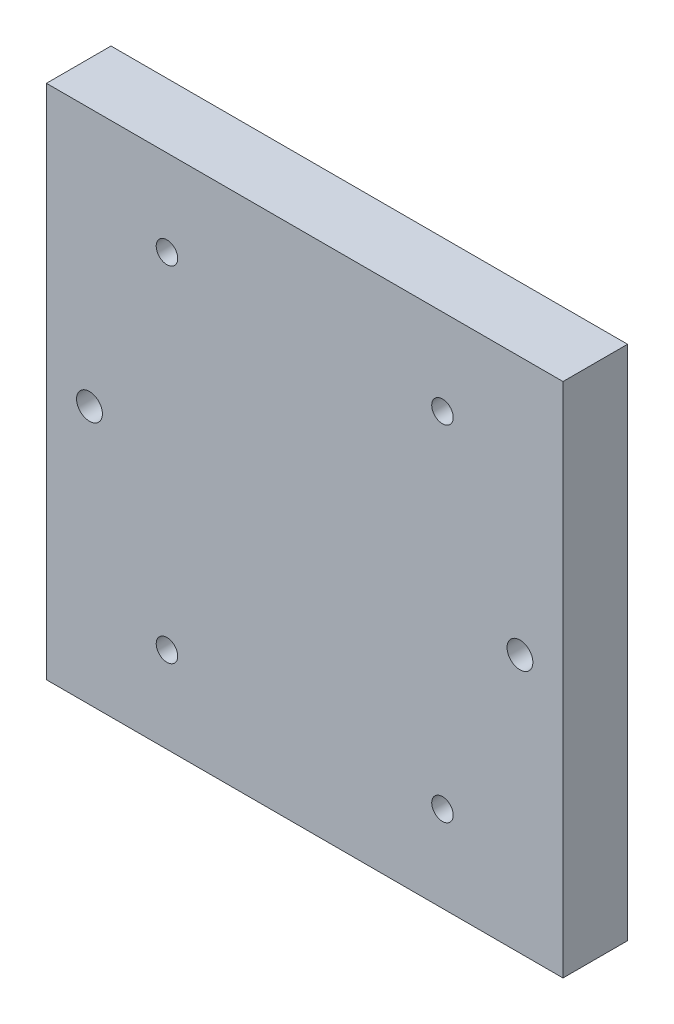
ISO-10303-21;
HEADER;
FILE_DESCRIPTION(('STEP AP214'),'2;1');
FILE_NAME('part.step','',(''),(''),'','','');
FILE_SCHEMA(('AUTOMOTIVE_DESIGN { 1 0 10303 214 1 1 1 1 }'));
ENDSEC;
DATA;
#1=APPLICATION_CONTEXT('core data for automotive mechanical design processes');
#2=APPLICATION_PROTOCOL_DEFINITION('international standard','automotive_design',2000,#1);
#3=PRODUCT_CONTEXT('',#1,'mechanical');
#4=PRODUCT('Part','Part','',(#3));
#5=PRODUCT_RELATED_PRODUCT_CATEGORY('part','',(#4));
#6=PRODUCT_DEFINITION_FORMATION('','',#4);
#7=PRODUCT_DEFINITION_CONTEXT('part definition',#1,'design');
#8=PRODUCT_DEFINITION('design','',#6,#7);
#9=PRODUCT_DEFINITION_SHAPE('','',#8);
#10=(LENGTH_UNIT() NAMED_UNIT(*) SI_UNIT(.MILLI.,.METRE.));
#11=(NAMED_UNIT(*) PLANE_ANGLE_UNIT() SI_UNIT($,.RADIAN.));
#12=(NAMED_UNIT(*) SI_UNIT($,.STERADIAN.) SOLID_ANGLE_UNIT());
#13=UNCERTAINTY_MEASURE_WITH_UNIT(LENGTH_MEASURE(1.E-05),#10,'distance_accuracy_value','');
#14=(GEOMETRIC_REPRESENTATION_CONTEXT(3) GLOBAL_UNCERTAINTY_ASSIGNED_CONTEXT((#13)) GLOBAL_UNIT_ASSIGNED_CONTEXT((#10,
#11,#12)) REPRESENTATION_CONTEXT('',''));
#15=CARTESIAN_POINT('',(0.,0.,0.));
#16=DIRECTION('',(0.,0.,1.));
#17=DIRECTION('',(1.,0.,0.));
#18=AXIS2_PLACEMENT_3D('',#15,#16,#17);
#19=CARTESIAN_POINT('',(60.,60.,-15.));
#20=DIRECTION('',(1.,0.,0.));
#21=DIRECTION('',(0.,1.,0.));
#22=AXIS2_PLACEMENT_3D('',#19,#20,#21);
#23=PLANE('',#22);
#24=DIRECTION('',(0.,1.,0.));
#25=VECTOR('',#24,1.);
#26=CARTESIAN_POINT('',(60.,60.,0.));
#27=LINE('',#26,#25);
#28=CARTESIAN_POINT('',(60.,-60.,0.));
#29=VERTEX_POINT('',#28);
#30=CARTESIAN_POINT('',(60.,60.,0.));
#31=VERTEX_POINT('',#30);
#32=EDGE_CURVE('E108',#29,#31,#27,.T.);
#33=ORIENTED_EDGE('',*,*,#32,.F.);
#34=DIRECTION('',(0.,0.,1.));
#35=VECTOR('',#34,1.);
#36=CARTESIAN_POINT('',(60.,-60.,-15.));
#37=LINE('',#36,#35);
#38=CARTESIAN_POINT('',(60.,-60.,-15.));
#39=VERTEX_POINT('',#38);
#40=EDGE_CURVE('E11',#39,#29,#37,.T.);
#41=ORIENTED_EDGE('',*,*,#40,.F.);
#42=DIRECTION('',(0.,1.,0.));
#43=VECTOR('',#42,1.);
#44=CARTESIAN_POINT('',(60.,60.,-15.));
#45=LINE('',#44,#43);
#46=CARTESIAN_POINT('',(60.,60.,-15.));
#47=VERTEX_POINT('',#46);
#48=EDGE_CURVE('E101',#39,#47,#45,.T.);
#49=ORIENTED_EDGE('',*,*,#48,.T.);
#50=DIRECTION('',(0.,0.,1.));
#51=VECTOR('',#50,1.);
#52=CARTESIAN_POINT('',(60.,60.,-15.));
#53=LINE('',#52,#51);
#54=EDGE_CURVE('E46',#47,#31,#53,.T.);
#55=ORIENTED_EDGE('',*,*,#54,.T.);
#56=EDGE_LOOP('',(#33,#41,#49,#55));
#57=FACE_BOUND('',#56,.T.);
#58=ADVANCED_FACE('F43',(#57),#23,.T.);
#59=CARTESIAN_POINT('',(-60.,-60.,-15.));
#60=DIRECTION('',(0.,-1.,0.));
#61=DIRECTION('',(0.,0.,-1.));
#62=AXIS2_PLACEMENT_3D('',#59,#60,#61);
#63=PLANE('',#62);
#64=DIRECTION('',(1.,0.,0.));
#65=VECTOR('',#64,1.);
#66=CARTESIAN_POINT('',(-60.,-60.,0.));
#67=LINE('',#66,#65);
#68=CARTESIAN_POINT('',(-60.,-60.,0.));
#69=VERTEX_POINT('',#68);
#70=EDGE_CURVE('E103',#69,#29,#67,.T.);
#71=ORIENTED_EDGE('',*,*,#70,.F.);
#72=DIRECTION('',(0.,0.,1.));
#73=VECTOR('',#72,1.);
#74=CARTESIAN_POINT('',(-60.,-60.,-15.));
#75=LINE('',#74,#73);
#76=CARTESIAN_POINT('',(-60.,-60.,-15.));
#77=VERTEX_POINT('',#76);
#78=EDGE_CURVE('E52',#77,#69,#75,.T.);
#79=ORIENTED_EDGE('',*,*,#78,.F.);
#80=DIRECTION('',(1.,0.,0.));
#81=VECTOR('',#80,1.);
#82=CARTESIAN_POINT('',(-60.,-60.,-15.));
#83=LINE('',#82,#81);
#84=EDGE_CURVE('E98',#77,#39,#83,.T.);
#85=ORIENTED_EDGE('',*,*,#84,.T.);
#86=ORIENTED_EDGE('',*,*,#40,.T.);
#87=EDGE_LOOP('',(#71,#79,#85,#86));
#88=FACE_BOUND('',#87,.T.);
#89=ADVANCED_FACE('F119',(#88),#63,.T.);
#90=CARTESIAN_POINT('',(-60.,60.,-15.));
#91=DIRECTION('',(-1.,0.,0.));
#92=DIRECTION('',(0.,-1.,0.));
#93=AXIS2_PLACEMENT_3D('',#90,#91,#92);
#94=PLANE('',#93);
#95=DIRECTION('',(0.,-1.,0.));
#96=VECTOR('',#95,1.);
#97=CARTESIAN_POINT('',(-60.,60.,0.));
#98=LINE('',#97,#96);
#99=CARTESIAN_POINT('',(-60.,60.,0.));
#100=VERTEX_POINT('',#99);
#101=EDGE_CURVE('E93',#100,#69,#98,.T.);
#102=ORIENTED_EDGE('',*,*,#101,.F.);
#103=DIRECTION('',(0.,0.,1.));
#104=VECTOR('',#103,1.);
#105=CARTESIAN_POINT('',(-60.,60.,-15.));
#106=LINE('',#105,#104);
#107=CARTESIAN_POINT('',(-60.,60.,-15.));
#108=VERTEX_POINT('',#107);
#109=EDGE_CURVE('E88',#108,#100,#106,.T.);
#110=ORIENTED_EDGE('',*,*,#109,.F.);
#111=DIRECTION('',(0.,-1.,0.));
#112=VECTOR('',#111,1.);
#113=CARTESIAN_POINT('',(-60.,60.,-15.));
#114=LINE('',#113,#112);
#115=EDGE_CURVE('E91',#108,#77,#114,.T.);
#116=ORIENTED_EDGE('',*,*,#115,.T.);
#117=ORIENTED_EDGE('',*,*,#78,.T.);
#118=EDGE_LOOP('',(#102,#110,#116,#117));
#119=FACE_BOUND('',#118,.T.);
#120=ADVANCED_FACE('F90',(#119),#94,.T.);
#121=CARTESIAN_POINT('',(-60.,60.,-15.));
#122=DIRECTION('',(0.,1.,0.));
#123=DIRECTION('',(0.,0.,1.));
#124=AXIS2_PLACEMENT_3D('',#121,#122,#123);
#125=PLANE('',#124);
#126=DIRECTION('',(-1.,0.,0.));
#127=VECTOR('',#126,1.);
#128=CARTESIAN_POINT('',(-60.,60.,0.));
#129=LINE('',#128,#127);
#130=EDGE_CURVE('E111',#31,#100,#129,.T.);
#131=ORIENTED_EDGE('',*,*,#130,.F.);
#132=ORIENTED_EDGE('',*,*,#54,.F.);
#133=DIRECTION('',(-1.,0.,0.));
#134=VECTOR('',#133,1.);
#135=CARTESIAN_POINT('',(-60.,60.,-15.));
#136=LINE('',#135,#134);
#137=EDGE_CURVE('E97',#47,#108,#136,.T.);
#138=ORIENTED_EDGE('',*,*,#137,.T.);
#139=ORIENTED_EDGE('',*,*,#109,.T.);
#140=EDGE_LOOP('',(#131,#132,#138,#139));
#141=FACE_BOUND('',#140,.T.);
#142=ADVANCED_FACE('F100',(#141),#125,.T.);
#143=CARTESIAN_POINT('',(0.,0.,-15.));
#144=DIRECTION('',(0.,0.,1.));
#145=DIRECTION('',(1.,0.,0.));
#146=AXIS2_PLACEMENT_3D('',#143,#144,#145);
#147=PLANE('',#146);
#148=CARTESIAN_POINT('',(-50.,0.,-15.));
#149=DIRECTION('',(0.,0.,-1.));
#150=DIRECTION('',(-1.,0.,0.));
#151=AXIS2_PLACEMENT_3D('',#148,#149,#150);
#152=CIRCLE('',#151,3.);
#153=CARTESIAN_POINT('',(-53.,0.,-15.));
#154=VERTEX_POINT('',#153);
#155=EDGE_CURVE('E112',#154,#154,#152,.T.);
#156=ORIENTED_EDGE('',*,*,#155,.F.);
#157=EDGE_LOOP('',(#156));
#158=FACE_BOUND('',#157,.T.);
#159=CARTESIAN_POINT('',(-32.,40.,-15.));
#160=DIRECTION('',(0.,0.,-1.));
#161=DIRECTION('',(-1.,0.,0.));
#162=AXIS2_PLACEMENT_3D('',#159,#160,#161);
#163=CIRCLE('',#162,2.5);
#164=CARTESIAN_POINT('',(-34.5,40.,-15.));
#165=VERTEX_POINT('',#164);
#166=EDGE_CURVE('E175',#165,#165,#163,.T.);
#167=ORIENTED_EDGE('',*,*,#166,.F.);
#168=EDGE_LOOP('',(#167));
#169=FACE_BOUND('',#168,.T.);
#170=CARTESIAN_POINT('',(50.,0.,-15.));
#171=DIRECTION('',(0.,0.,-1.));
#172=DIRECTION('',(1.,0.,0.));
#173=AXIS2_PLACEMENT_3D('',#170,#171,#172);
#174=CIRCLE('',#173,3.);
#175=CARTESIAN_POINT('',(47.,0.,-15.));
#176=VERTEX_POINT('',#175);
#177=EDGE_CURVE('E172',#176,#176,#174,.T.);
#178=ORIENTED_EDGE('',*,*,#177,.F.);
#179=EDGE_LOOP('',(#178));
#180=FACE_BOUND('',#179,.T.);
#181=CARTESIAN_POINT('',(32.,-40.,-15.));
#182=DIRECTION('',(0.,0.,-1.));
#183=DIRECTION('',(-1.,0.,0.));
#184=AXIS2_PLACEMENT_3D('',#181,#182,#183);
#185=CIRCLE('',#184,2.5);
#186=CARTESIAN_POINT('',(29.5,-40.,-15.));
#187=VERTEX_POINT('',#186);
#188=EDGE_CURVE('E199',#187,#187,#185,.T.);
#189=ORIENTED_EDGE('',*,*,#188,.F.);
#190=EDGE_LOOP('',(#189));
#191=FACE_BOUND('',#190,.T.);
#192=CARTESIAN_POINT('',(32.,40.,-15.));
#193=DIRECTION('',(0.,0.,-1.));
#194=DIRECTION('',(1.,0.,0.));
#195=AXIS2_PLACEMENT_3D('',#192,#193,#194);
#196=CIRCLE('',#195,2.5);
#197=CARTESIAN_POINT('',(29.5,40.,-15.));
#198=VERTEX_POINT('',#197);
#199=EDGE_CURVE('E182',#198,#198,#196,.T.);
#200=ORIENTED_EDGE('',*,*,#199,.F.);
#201=EDGE_LOOP('',(#200));
#202=FACE_BOUND('',#201,.T.);
#203=CARTESIAN_POINT('',(-32.,-40.,-15.));
#204=DIRECTION('',(0.,0.,-1.));
#205=DIRECTION('',(1.,0.,0.));
#206=AXIS2_PLACEMENT_3D('',#203,#204,#205);
#207=CIRCLE('',#206,2.5);
#208=CARTESIAN_POINT('',(-34.5,-40.,-15.));
#209=VERTEX_POINT('',#208);
#210=EDGE_CURVE('E189',#209,#209,#207,.T.);
#211=ORIENTED_EDGE('',*,*,#210,.F.);
#212=EDGE_LOOP('',(#211));
#213=FACE_BOUND('',#212,.T.);
#214=ORIENTED_EDGE('',*,*,#48,.F.);
#215=ORIENTED_EDGE('',*,*,#84,.F.);
#216=ORIENTED_EDGE('',*,*,#115,.F.);
#217=ORIENTED_EDGE('',*,*,#137,.F.);
#218=EDGE_LOOP('',(#214,#215,#216,#217));
#219=FACE_BOUND('',#218,.T.);
#220=ADVANCED_FACE('F96',(#158,#169,#180,#191,#202,#213,#219),#147,.F.);
#221=CARTESIAN_POINT('',(0.,0.,0.));
#222=DIRECTION('',(0.,0.,1.));
#223=DIRECTION('',(1.,0.,0.));
#224=AXIS2_PLACEMENT_3D('',#221,#222,#223);
#225=PLANE('',#224);
#226=CARTESIAN_POINT('',(-50.,0.,0.));
#227=DIRECTION('',(0.,0.,1.));
#228=DIRECTION('',(1.,0.,0.));
#229=AXIS2_PLACEMENT_3D('',#226,#227,#228);
#230=CIRCLE('',#229,3.);
#231=CARTESIAN_POINT('',(-53.,0.,0.));
#232=VERTEX_POINT('',#231);
#233=EDGE_CURVE('E169',#232,#232,#230,.F.);
#234=ORIENTED_EDGE('',*,*,#233,.T.);
#235=EDGE_LOOP('',(#234));
#236=FACE_BOUND('',#235,.T.);
#237=CARTESIAN_POINT('',(-32.,40.,0.));
#238=DIRECTION('',(0.,0.,1.));
#239=DIRECTION('',(1.,0.,0.));
#240=AXIS2_PLACEMENT_3D('',#237,#238,#239);
#241=CIRCLE('',#240,2.5);
#242=CARTESIAN_POINT('',(-34.5,40.,0.));
#243=VERTEX_POINT('',#242);
#244=EDGE_CURVE('E179',#243,#243,#241,.F.);
#245=ORIENTED_EDGE('',*,*,#244,.T.);
#246=EDGE_LOOP('',(#245));
#247=FACE_BOUND('',#246,.T.);
#248=CARTESIAN_POINT('',(50.,0.,0.));
#249=DIRECTION('',(0.,0.,1.));
#250=DIRECTION('',(1.,0.,0.));
#251=AXIS2_PLACEMENT_3D('',#248,#249,#250);
#252=CIRCLE('',#251,3.);
#253=CARTESIAN_POINT('',(47.,0.,0.));
#254=VERTEX_POINT('',#253);
#255=EDGE_CURVE('E196',#254,#254,#252,.F.);
#256=ORIENTED_EDGE('',*,*,#255,.T.);
#257=EDGE_LOOP('',(#256));
#258=FACE_BOUND('',#257,.T.);
#259=CARTESIAN_POINT('',(32.,-40.,0.));
#260=DIRECTION('',(0.,0.,1.));
#261=DIRECTION('',(1.,0.,0.));
#262=AXIS2_PLACEMENT_3D('',#259,#260,#261);
#263=CIRCLE('',#262,2.5);
#264=CARTESIAN_POINT('',(29.5,-40.,0.));
#265=VERTEX_POINT('',#264);
#266=EDGE_CURVE('E185',#265,#265,#263,.F.);
#267=ORIENTED_EDGE('',*,*,#266,.T.);
#268=EDGE_LOOP('',(#267));
#269=FACE_BOUND('',#268,.T.);
#270=CARTESIAN_POINT('',(32.,40.,0.));
#271=DIRECTION('',(0.,0.,1.));
#272=DIRECTION('',(1.,0.,0.));
#273=AXIS2_PLACEMENT_3D('',#270,#271,#272);
#274=CIRCLE('',#273,2.5);
#275=CARTESIAN_POINT('',(29.5,40.,0.));
#276=VERTEX_POINT('',#275);
#277=EDGE_CURVE('E186',#276,#276,#274,.F.);
#278=ORIENTED_EDGE('',*,*,#277,.T.);
#279=EDGE_LOOP('',(#278));
#280=FACE_BOUND('',#279,.T.);
#281=CARTESIAN_POINT('',(-32.,-40.,0.));
#282=DIRECTION('',(0.,0.,1.));
#283=DIRECTION('',(1.,0.,0.));
#284=AXIS2_PLACEMENT_3D('',#281,#282,#283);
#285=CIRCLE('',#284,2.5);
#286=CARTESIAN_POINT('',(-34.5,-40.,0.));
#287=VERTEX_POINT('',#286);
#288=EDGE_CURVE('E178',#287,#287,#285,.F.);
#289=ORIENTED_EDGE('',*,*,#288,.T.);
#290=EDGE_LOOP('',(#289));
#291=FACE_BOUND('',#290,.T.);
#292=ORIENTED_EDGE('',*,*,#32,.T.);
#293=ORIENTED_EDGE('',*,*,#130,.T.);
#294=ORIENTED_EDGE('',*,*,#101,.T.);
#295=ORIENTED_EDGE('',*,*,#70,.T.);
#296=EDGE_LOOP('',(#292,#293,#294,#295));
#297=FACE_BOUND('',#296,.T.);
#298=ADVANCED_FACE('F118',(#236,#247,#258,#269,#280,#291,#297),#225,.T.);
#299=CARTESIAN_POINT('',(-32.,-40.,0.000999999999999265));
#300=DIRECTION('',(0.,0.,-1.));
#301=DIRECTION('',(-1.,0.,0.));
#302=AXIS2_PLACEMENT_3D('',#299,#300,#301);
#303=CYLINDRICAL_SURFACE('',#302,2.5);
#304=CARTESIAN_POINT('',(-34.5,-40.,0.));
#305=CARTESIAN_POINT('',(-34.5,-40.,-0.15625));
#306=CARTESIAN_POINT('',(-34.5,-40.,-0.3125));
#307=CARTESIAN_POINT('',(-34.5,-40.,-0.625));
#308=CARTESIAN_POINT('',(-34.5,-40.,-0.78125));
#309=CARTESIAN_POINT('',(-34.5,-40.,-1.09375));
#310=CARTESIAN_POINT('',(-34.5,-40.,-1.25));
#311=CARTESIAN_POINT('',(-34.5,-40.,-1.5625));
#312=CARTESIAN_POINT('',(-34.5,-40.,-1.71875));
#313=CARTESIAN_POINT('',(-34.5,-40.,-2.03125));
#314=CARTESIAN_POINT('',(-34.5,-40.,-2.1875));
#315=CARTESIAN_POINT('',(-34.5,-40.,-2.5));
#316=CARTESIAN_POINT('',(-34.5,-40.,-2.65625));
#317=CARTESIAN_POINT('',(-34.5,-40.,-2.96875));
#318=CARTESIAN_POINT('',(-34.5,-40.,-3.125));
#319=CARTESIAN_POINT('',(-34.5,-40.,-3.4375));
#320=CARTESIAN_POINT('',(-34.5,-40.,-3.59375));
#321=CARTESIAN_POINT('',(-34.5,-40.,-3.90625));
#322=CARTESIAN_POINT('',(-34.5,-40.,-4.0625));
#323=CARTESIAN_POINT('',(-34.5,-40.,-4.375));
#324=CARTESIAN_POINT('',(-34.5,-40.,-4.53125));
#325=CARTESIAN_POINT('',(-34.5,-40.,-4.84375));
#326=CARTESIAN_POINT('',(-34.5,-40.,-5.));
#327=CARTESIAN_POINT('',(-34.5,-40.,-5.3125));
#328=CARTESIAN_POINT('',(-34.5,-40.,-5.46875));
#329=CARTESIAN_POINT('',(-34.5,-40.,-5.78125));
#330=CARTESIAN_POINT('',(-34.5,-40.,-5.9375));
#331=CARTESIAN_POINT('',(-34.5,-40.,-6.25));
#332=CARTESIAN_POINT('',(-34.5,-40.,-6.40625));
#333=CARTESIAN_POINT('',(-34.5,-40.,-6.71875));
#334=CARTESIAN_POINT('',(-34.5,-40.,-6.875));
#335=CARTESIAN_POINT('',(-34.5,-40.,-7.1875));
#336=CARTESIAN_POINT('',(-34.5,-40.,-7.34375));
#337=CARTESIAN_POINT('',(-34.5,-40.,-7.65625));
#338=CARTESIAN_POINT('',(-34.5,-40.,-7.8125));
#339=CARTESIAN_POINT('',(-34.5,-40.,-8.125));
#340=CARTESIAN_POINT('',(-34.5,-40.,-8.28125));
#341=CARTESIAN_POINT('',(-34.5,-40.,-8.59375));
#342=CARTESIAN_POINT('',(-34.5,-40.,-8.75));
#343=CARTESIAN_POINT('',(-34.5,-40.,-9.0625));
#344=CARTESIAN_POINT('',(-34.5,-40.,-9.21875));
#345=CARTESIAN_POINT('',(-34.5,-40.,-9.53125));
#346=CARTESIAN_POINT('',(-34.5,-40.,-9.6875));
#347=CARTESIAN_POINT('',(-34.5,-40.,-10.));
#348=CARTESIAN_POINT('',(-34.5,-40.,-10.15625));
#349=CARTESIAN_POINT('',(-34.5,-40.,-10.46875));
#350=CARTESIAN_POINT('',(-34.5,-40.,-10.625));
#351=CARTESIAN_POINT('',(-34.5,-40.,-10.9375));
#352=CARTESIAN_POINT('',(-34.5,-40.,-11.09375));
#353=CARTESIAN_POINT('',(-34.5,-40.,-11.40625));
#354=CARTESIAN_POINT('',(-34.5,-40.,-11.5625));
#355=CARTESIAN_POINT('',(-34.5,-40.,-11.875));
#356=CARTESIAN_POINT('',(-34.5,-40.,-12.03125));
#357=CARTESIAN_POINT('',(-34.5,-40.,-12.34375));
#358=CARTESIAN_POINT('',(-34.5,-40.,-12.5));
#359=CARTESIAN_POINT('',(-34.5,-40.,-12.8125));
#360=CARTESIAN_POINT('',(-34.5,-40.,-12.96875));
#361=CARTESIAN_POINT('',(-34.5,-40.,-13.28125));
#362=CARTESIAN_POINT('',(-34.5,-40.,-13.4375));
#363=CARTESIAN_POINT('',(-34.5,-40.,-13.75));
#364=CARTESIAN_POINT('',(-34.5,-40.,-13.90625));
#365=CARTESIAN_POINT('',(-34.5,-40.,-14.21875));
#366=CARTESIAN_POINT('',(-34.5,-40.,-14.375));
#367=CARTESIAN_POINT('',(-34.5,-40.,-14.6875));
#368=CARTESIAN_POINT('',(-34.5,-40.,-14.84375));
#369=CARTESIAN_POINT('',(-34.5,-40.,-15.));
#370=B_SPLINE_CURVE_WITH_KNOTS('',3,(#304,#305,#306,#307,#308,#309,#310,#311,#312,#313,#314,
#315,#316,#317,#318,#319,#320,#321,#322,#323,#324,#325,#326,#327,#328,#329,#330,#331,#332,#333,
#334,#335,#336,#337,#338,#339,#340,#341,#342,#343,#344,#345,#346,#347,#348,#349,#350,#351,#352,
#353,#354,#355,#356,#357,#358,#359,#360,#361,#362,#363,#364,#365,#366,#367,#368,#369),
.UNSPECIFIED.,.F.,.F.,(4,2,2,2,2,2,2,2,2,2,2,2,2,2,2,2,2,2,2,2,2,2,2,2,2,2,2,2,2,2,2,2,4),(0.,
0.46875,0.9375,1.40625,1.875,2.34375,2.8125,3.28125,3.75,4.21875,4.6875,5.15625,5.625,6.09375,
6.5625,7.03125,7.5,7.96875,8.4375,8.90625,9.375,9.84375,10.3125,10.78125,11.25,11.71875,12.1875,
12.65625,13.125,13.59375,14.0625,14.53125,15.),.UNSPECIFIED.);
#371=EDGE_CURVE('BSEAM137',#287,#209,#370,.T.);
#372=ORIENTED_EDGE('',*,*,#288,.F.);
#373=ORIENTED_EDGE('',*,*,#210,.T.);
#374=ORIENTED_EDGE('',*,*,#371,.T.);
#375=ORIENTED_EDGE('',*,*,#371,.F.);
#376=EDGE_LOOP('',(#372,#374,#373,#375));
#377=FACE_BOUND('',#376,.T.);
#378=ADVANCED_FACE('F137',(#377),#303,.F.);
#379=CARTESIAN_POINT('',(32.,40.,0.000999999999999265));
#380=DIRECTION('',(0.,0.,-1.));
#381=DIRECTION('',(-1.,0.,0.));
#382=AXIS2_PLACEMENT_3D('',#379,#380,#381);
#383=CYLINDRICAL_SURFACE('',#382,2.5);
#384=CARTESIAN_POINT('',(29.5,40.,0.));
#385=CARTESIAN_POINT('',(29.5,40.,-0.15625));
#386=CARTESIAN_POINT('',(29.5,40.,-0.3125));
#387=CARTESIAN_POINT('',(29.5,40.,-0.625));
#388=CARTESIAN_POINT('',(29.5,40.,-0.78125));
#389=CARTESIAN_POINT('',(29.5,40.,-1.09375));
#390=CARTESIAN_POINT('',(29.5,40.,-1.25));
#391=CARTESIAN_POINT('',(29.5,40.,-1.5625));
#392=CARTESIAN_POINT('',(29.5,40.,-1.71875));
#393=CARTESIAN_POINT('',(29.5,40.,-2.03125));
#394=CARTESIAN_POINT('',(29.5,40.,-2.1875));
#395=CARTESIAN_POINT('',(29.5,40.,-2.5));
#396=CARTESIAN_POINT('',(29.5,40.,-2.65625));
#397=CARTESIAN_POINT('',(29.5,40.,-2.96875));
#398=CARTESIAN_POINT('',(29.5,40.,-3.125));
#399=CARTESIAN_POINT('',(29.5,40.,-3.4375));
#400=CARTESIAN_POINT('',(29.5,40.,-3.59375));
#401=CARTESIAN_POINT('',(29.5,40.,-3.90625));
#402=CARTESIAN_POINT('',(29.5,40.,-4.0625));
#403=CARTESIAN_POINT('',(29.5,40.,-4.375));
#404=CARTESIAN_POINT('',(29.5,40.,-4.53125));
#405=CARTESIAN_POINT('',(29.5,40.,-4.84375));
#406=CARTESIAN_POINT('',(29.5,40.,-5.));
#407=CARTESIAN_POINT('',(29.5,40.,-5.3125));
#408=CARTESIAN_POINT('',(29.5,40.,-5.46875));
#409=CARTESIAN_POINT('',(29.5,40.,-5.78125));
#410=CARTESIAN_POINT('',(29.5,40.,-5.9375));
#411=CARTESIAN_POINT('',(29.5,40.,-6.25));
#412=CARTESIAN_POINT('',(29.5,40.,-6.40625));
#413=CARTESIAN_POINT('',(29.5,40.,-6.71875));
#414=CARTESIAN_POINT('',(29.5,40.,-6.875));
#415=CARTESIAN_POINT('',(29.5,40.,-7.1875));
#416=CARTESIAN_POINT('',(29.5,40.,-7.34375));
#417=CARTESIAN_POINT('',(29.5,40.,-7.65625));
#418=CARTESIAN_POINT('',(29.5,40.,-7.8125));
#419=CARTESIAN_POINT('',(29.5,40.,-8.125));
#420=CARTESIAN_POINT('',(29.5,40.,-8.28125));
#421=CARTESIAN_POINT('',(29.5,40.,-8.59375));
#422=CARTESIAN_POINT('',(29.5,40.,-8.75));
#423=CARTESIAN_POINT('',(29.5,40.,-9.0625));
#424=CARTESIAN_POINT('',(29.5,40.,-9.21875));
#425=CARTESIAN_POINT('',(29.5,40.,-9.53125));
#426=CARTESIAN_POINT('',(29.5,40.,-9.6875));
#427=CARTESIAN_POINT('',(29.5,40.,-10.));
#428=CARTESIAN_POINT('',(29.5,40.,-10.15625));
#429=CARTESIAN_POINT('',(29.5,40.,-10.46875));
#430=CARTESIAN_POINT('',(29.5,40.,-10.625));
#431=CARTESIAN_POINT('',(29.5,40.,-10.9375));
#432=CARTESIAN_POINT('',(29.5,40.,-11.09375));
#433=CARTESIAN_POINT('',(29.5,40.,-11.40625));
#434=CARTESIAN_POINT('',(29.5,40.,-11.5625));
#435=CARTESIAN_POINT('',(29.5,40.,-11.875));
#436=CARTESIAN_POINT('',(29.5,40.,-12.03125));
#437=CARTESIAN_POINT('',(29.5,40.,-12.34375));
#438=CARTESIAN_POINT('',(29.5,40.,-12.5));
#439=CARTESIAN_POINT('',(29.5,40.,-12.8125));
#440=CARTESIAN_POINT('',(29.5,40.,-12.96875));
#441=CARTESIAN_POINT('',(29.5,40.,-13.28125));
#442=CARTESIAN_POINT('',(29.5,40.,-13.4375));
#443=CARTESIAN_POINT('',(29.5,40.,-13.75));
#444=CARTESIAN_POINT('',(29.5,40.,-13.90625));
#445=CARTESIAN_POINT('',(29.5,40.,-14.21875));
#446=CARTESIAN_POINT('',(29.5,40.,-14.375));
#447=CARTESIAN_POINT('',(29.5,40.,-14.6875));
#448=CARTESIAN_POINT('',(29.5,40.,-14.84375));
#449=CARTESIAN_POINT('',(29.5,40.,-15.));
#450=B_SPLINE_CURVE_WITH_KNOTS('',3,(#384,#385,#386,#387,#388,#389,#390,#391,#392,#393,#394,
#395,#396,#397,#398,#399,#400,#401,#402,#403,#404,#405,#406,#407,#408,#409,#410,#411,#412,#413,
#414,#415,#416,#417,#418,#419,#420,#421,#422,#423,#424,#425,#426,#427,#428,#429,#430,#431,#432,
#433,#434,#435,#436,#437,#438,#439,#440,#441,#442,#443,#444,#445,#446,#447,#448,#449),
.UNSPECIFIED.,.F.,.F.,(4,2,2,2,2,2,2,2,2,2,2,2,2,2,2,2,2,2,2,2,2,2,2,2,2,2,2,2,2,2,2,2,4),(0.,
0.46875,0.9375,1.40625,1.875,2.34375,2.8125,3.28125,3.75,4.21875,4.6875,5.15625,5.625,6.09375,
6.5625,7.03125,7.5,7.96875,8.4375,8.90625,9.375,9.84375,10.3125,10.78125,11.25,11.71875,12.1875,
12.65625,13.125,13.59375,14.0625,14.53125,15.),.UNSPECIFIED.);
#451=EDGE_CURVE('BSEAM146',#276,#198,#450,.T.);
#452=ORIENTED_EDGE('',*,*,#277,.F.);
#453=ORIENTED_EDGE('',*,*,#199,.T.);
#454=ORIENTED_EDGE('',*,*,#451,.T.);
#455=ORIENTED_EDGE('',*,*,#451,.F.);
#456=EDGE_LOOP('',(#452,#454,#453,#455));
#457=FACE_BOUND('',#456,.T.);
#458=ADVANCED_FACE('F146',(#457),#383,.F.);
#459=CARTESIAN_POINT('',(32.,-40.,0.000999999999999265));
#460=DIRECTION('',(0.,0.,-1.));
#461=DIRECTION('',(-1.,0.,0.));
#462=AXIS2_PLACEMENT_3D('',#459,#460,#461);
#463=CYLINDRICAL_SURFACE('',#462,2.5);
#464=CARTESIAN_POINT('',(29.5,-40.,0.));
#465=CARTESIAN_POINT('',(29.5,-40.,-0.15625));
#466=CARTESIAN_POINT('',(29.5,-40.,-0.3125));
#467=CARTESIAN_POINT('',(29.5,-40.,-0.625));
#468=CARTESIAN_POINT('',(29.5,-40.,-0.78125));
#469=CARTESIAN_POINT('',(29.5,-40.,-1.09375));
#470=CARTESIAN_POINT('',(29.5,-40.,-1.25));
#471=CARTESIAN_POINT('',(29.5,-40.,-1.5625));
#472=CARTESIAN_POINT('',(29.5,-40.,-1.71875));
#473=CARTESIAN_POINT('',(29.5,-40.,-2.03125));
#474=CARTESIAN_POINT('',(29.5,-40.,-2.1875));
#475=CARTESIAN_POINT('',(29.5,-40.,-2.5));
#476=CARTESIAN_POINT('',(29.5,-40.,-2.65625));
#477=CARTESIAN_POINT('',(29.5,-40.,-2.96875));
#478=CARTESIAN_POINT('',(29.5,-40.,-3.125));
#479=CARTESIAN_POINT('',(29.5,-40.,-3.4375));
#480=CARTESIAN_POINT('',(29.5,-40.,-3.59375));
#481=CARTESIAN_POINT('',(29.5,-40.,-3.90625));
#482=CARTESIAN_POINT('',(29.5,-40.,-4.0625));
#483=CARTESIAN_POINT('',(29.5,-40.,-4.375));
#484=CARTESIAN_POINT('',(29.5,-40.,-4.53125));
#485=CARTESIAN_POINT('',(29.5,-40.,-4.84375));
#486=CARTESIAN_POINT('',(29.5,-40.,-5.));
#487=CARTESIAN_POINT('',(29.5,-40.,-5.3125));
#488=CARTESIAN_POINT('',(29.5,-40.,-5.46875));
#489=CARTESIAN_POINT('',(29.5,-40.,-5.78125));
#490=CARTESIAN_POINT('',(29.5,-40.,-5.9375));
#491=CARTESIAN_POINT('',(29.5,-40.,-6.25));
#492=CARTESIAN_POINT('',(29.5,-40.,-6.40625));
#493=CARTESIAN_POINT('',(29.5,-40.,-6.71875));
#494=CARTESIAN_POINT('',(29.5,-40.,-6.875));
#495=CARTESIAN_POINT('',(29.5,-40.,-7.1875));
#496=CARTESIAN_POINT('',(29.5,-40.,-7.34375));
#497=CARTESIAN_POINT('',(29.5,-40.,-7.65625));
#498=CARTESIAN_POINT('',(29.5,-40.,-7.8125));
#499=CARTESIAN_POINT('',(29.5,-40.,-8.125));
#500=CARTESIAN_POINT('',(29.5,-40.,-8.28125));
#501=CARTESIAN_POINT('',(29.5,-40.,-8.59375));
#502=CARTESIAN_POINT('',(29.5,-40.,-8.75));
#503=CARTESIAN_POINT('',(29.5,-40.,-9.0625));
#504=CARTESIAN_POINT('',(29.5,-40.,-9.21875));
#505=CARTESIAN_POINT('',(29.5,-40.,-9.53125));
#506=CARTESIAN_POINT('',(29.5,-40.,-9.6875));
#507=CARTESIAN_POINT('',(29.5,-40.,-10.));
#508=CARTESIAN_POINT('',(29.5,-40.,-10.15625));
#509=CARTESIAN_POINT('',(29.5,-40.,-10.46875));
#510=CARTESIAN_POINT('',(29.5,-40.,-10.625));
#511=CARTESIAN_POINT('',(29.5,-40.,-10.9375));
#512=CARTESIAN_POINT('',(29.5,-40.,-11.09375));
#513=CARTESIAN_POINT('',(29.5,-40.,-11.40625));
#514=CARTESIAN_POINT('',(29.5,-40.,-11.5625));
#515=CARTESIAN_POINT('',(29.5,-40.,-11.875));
#516=CARTESIAN_POINT('',(29.5,-40.,-12.03125));
#517=CARTESIAN_POINT('',(29.5,-40.,-12.34375));
#518=CARTESIAN_POINT('',(29.5,-40.,-12.5));
#519=CARTESIAN_POINT('',(29.5,-40.,-12.8125));
#520=CARTESIAN_POINT('',(29.5,-40.,-12.96875));
#521=CARTESIAN_POINT('',(29.5,-40.,-13.28125));
#522=CARTESIAN_POINT('',(29.5,-40.,-13.4375));
#523=CARTESIAN_POINT('',(29.5,-40.,-13.75));
#524=CARTESIAN_POINT('',(29.5,-40.,-13.90625));
#525=CARTESIAN_POINT('',(29.5,-40.,-14.21875));
#526=CARTESIAN_POINT('',(29.5,-40.,-14.375));
#527=CARTESIAN_POINT('',(29.5,-40.,-14.6875));
#528=CARTESIAN_POINT('',(29.5,-40.,-14.84375));
#529=CARTESIAN_POINT('',(29.5,-40.,-15.));
#530=B_SPLINE_CURVE_WITH_KNOTS('',3,(#464,#465,#466,#467,#468,#469,#470,#471,#472,#473,#474,
#475,#476,#477,#478,#479,#480,#481,#482,#483,#484,#485,#486,#487,#488,#489,#490,#491,#492,#493,
#494,#495,#496,#497,#498,#499,#500,#501,#502,#503,#504,#505,#506,#507,#508,#509,#510,#511,#512,
#513,#514,#515,#516,#517,#518,#519,#520,#521,#522,#523,#524,#525,#526,#527,#528,#529),
.UNSPECIFIED.,.F.,.F.,(4,2,2,2,2,2,2,2,2,2,2,2,2,2,2,2,2,2,2,2,2,2,2,2,2,2,2,2,2,2,2,2,4),(0.,
0.46875,0.9375,1.40625,1.875,2.34375,2.8125,3.28125,3.75,4.21875,4.6875,5.15625,5.625,6.09375,
6.5625,7.03125,7.5,7.96875,8.4375,8.90625,9.375,9.84375,10.3125,10.78125,11.25,11.71875,12.1875,
12.65625,13.125,13.59375,14.0625,14.53125,15.),.UNSPECIFIED.);
#531=EDGE_CURVE('BSEAM142',#265,#187,#530,.T.);
#532=ORIENTED_EDGE('',*,*,#266,.F.);
#533=ORIENTED_EDGE('',*,*,#188,.T.);
#534=ORIENTED_EDGE('',*,*,#531,.T.);
#535=ORIENTED_EDGE('',*,*,#531,.F.);
#536=EDGE_LOOP('',(#532,#534,#533,#535));
#537=FACE_BOUND('',#536,.T.);
#538=ADVANCED_FACE('F142',(#537),#463,.F.);
#539=CARTESIAN_POINT('',(50.,0.,0.000999999999999265));
#540=DIRECTION('',(0.,0.,-1.));
#541=DIRECTION('',(-1.,0.,0.));
#542=AXIS2_PLACEMENT_3D('',#539,#540,#541);
#543=CYLINDRICAL_SURFACE('',#542,3.);
#544=CARTESIAN_POINT('',(47.,0.,0.));
#545=CARTESIAN_POINT('',(47.,0.,-0.15625));
#546=CARTESIAN_POINT('',(47.,0.,-0.3125));
#547=CARTESIAN_POINT('',(47.,0.,-0.625));
#548=CARTESIAN_POINT('',(47.,0.,-0.78125));
#549=CARTESIAN_POINT('',(47.,0.,-1.09375));
#550=CARTESIAN_POINT('',(47.,0.,-1.25));
#551=CARTESIAN_POINT('',(47.,0.,-1.5625));
#552=CARTESIAN_POINT('',(47.,0.,-1.71875));
#553=CARTESIAN_POINT('',(47.,0.,-2.03125));
#554=CARTESIAN_POINT('',(47.,0.,-2.1875));
#555=CARTESIAN_POINT('',(47.,0.,-2.5));
#556=CARTESIAN_POINT('',(47.,0.,-2.65625));
#557=CARTESIAN_POINT('',(47.,0.,-2.96875));
#558=CARTESIAN_POINT('',(47.,0.,-3.125));
#559=CARTESIAN_POINT('',(47.,0.,-3.4375));
#560=CARTESIAN_POINT('',(47.,0.,-3.59375));
#561=CARTESIAN_POINT('',(47.,0.,-3.90625));
#562=CARTESIAN_POINT('',(47.,0.,-4.0625));
#563=CARTESIAN_POINT('',(47.,0.,-4.375));
#564=CARTESIAN_POINT('',(47.,0.,-4.53125));
#565=CARTESIAN_POINT('',(47.,0.,-4.84375));
#566=CARTESIAN_POINT('',(47.,0.,-5.));
#567=CARTESIAN_POINT('',(47.,0.,-5.3125));
#568=CARTESIAN_POINT('',(47.,0.,-5.46875));
#569=CARTESIAN_POINT('',(47.,0.,-5.78125));
#570=CARTESIAN_POINT('',(47.,0.,-5.9375));
#571=CARTESIAN_POINT('',(47.,0.,-6.25));
#572=CARTESIAN_POINT('',(47.,0.,-6.40625));
#573=CARTESIAN_POINT('',(47.,0.,-6.71875));
#574=CARTESIAN_POINT('',(47.,0.,-6.875));
#575=CARTESIAN_POINT('',(47.,0.,-7.1875));
#576=CARTESIAN_POINT('',(47.,0.,-7.34375));
#577=CARTESIAN_POINT('',(47.,0.,-7.65625));
#578=CARTESIAN_POINT('',(47.,0.,-7.8125));
#579=CARTESIAN_POINT('',(47.,0.,-8.125));
#580=CARTESIAN_POINT('',(47.,0.,-8.28125));
#581=CARTESIAN_POINT('',(47.,0.,-8.59375));
#582=CARTESIAN_POINT('',(47.,0.,-8.75));
#583=CARTESIAN_POINT('',(47.,0.,-9.0625));
#584=CARTESIAN_POINT('',(47.,0.,-9.21875));
#585=CARTESIAN_POINT('',(47.,0.,-9.53125));
#586=CARTESIAN_POINT('',(47.,0.,-9.6875));
#587=CARTESIAN_POINT('',(47.,0.,-10.));
#588=CARTESIAN_POINT('',(47.,0.,-10.15625));
#589=CARTESIAN_POINT('',(47.,0.,-10.46875));
#590=CARTESIAN_POINT('',(47.,0.,-10.625));
#591=CARTESIAN_POINT('',(47.,0.,-10.9375));
#592=CARTESIAN_POINT('',(47.,0.,-11.09375));
#593=CARTESIAN_POINT('',(47.,0.,-11.40625));
#594=CARTESIAN_POINT('',(47.,0.,-11.5625));
#595=CARTESIAN_POINT('',(47.,0.,-11.875));
#596=CARTESIAN_POINT('',(47.,0.,-12.03125));
#597=CARTESIAN_POINT('',(47.,0.,-12.34375));
#598=CARTESIAN_POINT('',(47.,0.,-12.5));
#599=CARTESIAN_POINT('',(47.,0.,-12.8125));
#600=CARTESIAN_POINT('',(47.,0.,-12.96875));
#601=CARTESIAN_POINT('',(47.,0.,-13.28125));
#602=CARTESIAN_POINT('',(47.,0.,-13.4375));
#603=CARTESIAN_POINT('',(47.,0.,-13.75));
#604=CARTESIAN_POINT('',(47.,0.,-13.90625));
#605=CARTESIAN_POINT('',(47.,0.,-14.21875));
#606=CARTESIAN_POINT('',(47.,0.,-14.375));
#607=CARTESIAN_POINT('',(47.,0.,-14.6875));
#608=CARTESIAN_POINT('',(47.,0.,-14.84375));
#609=CARTESIAN_POINT('',(47.,0.,-15.));
#610=B_SPLINE_CURVE_WITH_KNOTS('',3,(#544,#545,#546,#547,#548,#549,#550,#551,#552,#553,#554,
#555,#556,#557,#558,#559,#560,#561,#562,#563,#564,#565,#566,#567,#568,#569,#570,#571,#572,#573,
#574,#575,#576,#577,#578,#579,#580,#581,#582,#583,#584,#585,#586,#587,#588,#589,#590,#591,#592,
#593,#594,#595,#596,#597,#598,#599,#600,#601,#602,#603,#604,#605,#606,#607,#608,#609),
.UNSPECIFIED.,.F.,.F.,(4,2,2,2,2,2,2,2,2,2,2,2,2,2,2,2,2,2,2,2,2,2,2,2,2,2,2,2,2,2,2,2,4),(0.,
0.46875,0.9375,1.40625,1.875,2.34375,2.8125,3.28125,3.75,4.21875,4.6875,5.15625,5.625,6.09375,
6.5625,7.03125,7.5,7.96875,8.4375,8.90625,9.375,9.84375,10.3125,10.78125,11.25,11.71875,12.1875,
12.65625,13.125,13.59375,14.0625,14.53125,15.),.UNSPECIFIED.);
#611=EDGE_CURVE('BSEAM145',#254,#176,#610,.T.);
#612=ORIENTED_EDGE('',*,*,#255,.F.);
#613=ORIENTED_EDGE('',*,*,#177,.T.);
#614=ORIENTED_EDGE('',*,*,#611,.T.);
#615=ORIENTED_EDGE('',*,*,#611,.F.);
#616=EDGE_LOOP('',(#612,#614,#613,#615));
#617=FACE_BOUND('',#616,.T.);
#618=ADVANCED_FACE('F145',(#617),#543,.F.);
#619=CARTESIAN_POINT('',(-32.,40.,0.000999999999999265));
#620=DIRECTION('',(0.,0.,-1.));
#621=DIRECTION('',(-1.,0.,0.));
#622=AXIS2_PLACEMENT_3D('',#619,#620,#621);
#623=CYLINDRICAL_SURFACE('',#622,2.5);
#624=CARTESIAN_POINT('',(-34.5,40.,0.));
#625=CARTESIAN_POINT('',(-34.5,40.,-0.15625));
#626=CARTESIAN_POINT('',(-34.5,40.,-0.3125));
#627=CARTESIAN_POINT('',(-34.5,40.,-0.625));
#628=CARTESIAN_POINT('',(-34.5,40.,-0.78125));
#629=CARTESIAN_POINT('',(-34.5,40.,-1.09375));
#630=CARTESIAN_POINT('',(-34.5,40.,-1.25));
#631=CARTESIAN_POINT('',(-34.5,40.,-1.5625));
#632=CARTESIAN_POINT('',(-34.5,40.,-1.71875));
#633=CARTESIAN_POINT('',(-34.5,40.,-2.03125));
#634=CARTESIAN_POINT('',(-34.5,40.,-2.1875));
#635=CARTESIAN_POINT('',(-34.5,40.,-2.5));
#636=CARTESIAN_POINT('',(-34.5,40.,-2.65625));
#637=CARTESIAN_POINT('',(-34.5,40.,-2.96875));
#638=CARTESIAN_POINT('',(-34.5,40.,-3.125));
#639=CARTESIAN_POINT('',(-34.5,40.,-3.4375));
#640=CARTESIAN_POINT('',(-34.5,40.,-3.59375));
#641=CARTESIAN_POINT('',(-34.5,40.,-3.90625));
#642=CARTESIAN_POINT('',(-34.5,40.,-4.0625));
#643=CARTESIAN_POINT('',(-34.5,40.,-4.375));
#644=CARTESIAN_POINT('',(-34.5,40.,-4.53125));
#645=CARTESIAN_POINT('',(-34.5,40.,-4.84375));
#646=CARTESIAN_POINT('',(-34.5,40.,-5.));
#647=CARTESIAN_POINT('',(-34.5,40.,-5.3125));
#648=CARTESIAN_POINT('',(-34.5,40.,-5.46875));
#649=CARTESIAN_POINT('',(-34.5,40.,-5.78125));
#650=CARTESIAN_POINT('',(-34.5,40.,-5.9375));
#651=CARTESIAN_POINT('',(-34.5,40.,-6.25));
#652=CARTESIAN_POINT('',(-34.5,40.,-6.40625));
#653=CARTESIAN_POINT('',(-34.5,40.,-6.71875));
#654=CARTESIAN_POINT('',(-34.5,40.,-6.875));
#655=CARTESIAN_POINT('',(-34.5,40.,-7.1875));
#656=CARTESIAN_POINT('',(-34.5,40.,-7.34375));
#657=CARTESIAN_POINT('',(-34.5,40.,-7.65625));
#658=CARTESIAN_POINT('',(-34.5,40.,-7.8125));
#659=CARTESIAN_POINT('',(-34.5,40.,-8.125));
#660=CARTESIAN_POINT('',(-34.5,40.,-8.28125));
#661=CARTESIAN_POINT('',(-34.5,40.,-8.59375));
#662=CARTESIAN_POINT('',(-34.5,40.,-8.75));
#663=CARTESIAN_POINT('',(-34.5,40.,-9.0625));
#664=CARTESIAN_POINT('',(-34.5,40.,-9.21875));
#665=CARTESIAN_POINT('',(-34.5,40.,-9.53125));
#666=CARTESIAN_POINT('',(-34.5,40.,-9.6875));
#667=CARTESIAN_POINT('',(-34.5,40.,-10.));
#668=CARTESIAN_POINT('',(-34.5,40.,-10.15625));
#669=CARTESIAN_POINT('',(-34.5,40.,-10.46875));
#670=CARTESIAN_POINT('',(-34.5,40.,-10.625));
#671=CARTESIAN_POINT('',(-34.5,40.,-10.9375));
#672=CARTESIAN_POINT('',(-34.5,40.,-11.09375));
#673=CARTESIAN_POINT('',(-34.5,40.,-11.40625));
#674=CARTESIAN_POINT('',(-34.5,40.,-11.5625));
#675=CARTESIAN_POINT('',(-34.5,40.,-11.875));
#676=CARTESIAN_POINT('',(-34.5,40.,-12.03125));
#677=CARTESIAN_POINT('',(-34.5,40.,-12.34375));
#678=CARTESIAN_POINT('',(-34.5,40.,-12.5));
#679=CARTESIAN_POINT('',(-34.5,40.,-12.8125));
#680=CARTESIAN_POINT('',(-34.5,40.,-12.96875));
#681=CARTESIAN_POINT('',(-34.5,40.,-13.28125));
#682=CARTESIAN_POINT('',(-34.5,40.,-13.4375));
#683=CARTESIAN_POINT('',(-34.5,40.,-13.75));
#684=CARTESIAN_POINT('',(-34.5,40.,-13.90625));
#685=CARTESIAN_POINT('',(-34.5,40.,-14.21875));
#686=CARTESIAN_POINT('',(-34.5,40.,-14.375));
#687=CARTESIAN_POINT('',(-34.5,40.,-14.6875));
#688=CARTESIAN_POINT('',(-34.5,40.,-14.84375));
#689=CARTESIAN_POINT('',(-34.5,40.,-15.));
#690=B_SPLINE_CURVE_WITH_KNOTS('',3,(#624,#625,#626,#627,#628,#629,#630,#631,#632,#633,#634,
#635,#636,#637,#638,#639,#640,#641,#642,#643,#644,#645,#646,#647,#648,#649,#650,#651,#652,#653,
#654,#655,#656,#657,#658,#659,#660,#661,#662,#663,#664,#665,#666,#667,#668,#669,#670,#671,#672,
#673,#674,#675,#676,#677,#678,#679,#680,#681,#682,#683,#684,#685,#686,#687,#688,#689),
.UNSPECIFIED.,.F.,.F.,(4,2,2,2,2,2,2,2,2,2,2,2,2,2,2,2,2,2,2,2,2,2,2,2,2,2,2,2,2,2,2,2,4),(0.,
0.46875,0.9375,1.40625,1.875,2.34375,2.8125,3.28125,3.75,4.21875,4.6875,5.15625,5.625,6.09375,
6.5625,7.03125,7.5,7.96875,8.4375,8.90625,9.375,9.84375,10.3125,10.78125,11.25,11.71875,12.1875,
12.65625,13.125,13.59375,14.0625,14.53125,15.),.UNSPECIFIED.);
#691=EDGE_CURVE('BSEAM150',#243,#165,#690,.T.);
#692=ORIENTED_EDGE('',*,*,#244,.F.);
#693=ORIENTED_EDGE('',*,*,#166,.T.);
#694=ORIENTED_EDGE('',*,*,#691,.T.);
#695=ORIENTED_EDGE('',*,*,#691,.F.);
#696=EDGE_LOOP('',(#692,#694,#693,#695));
#697=FACE_BOUND('',#696,.T.);
#698=ADVANCED_FACE('F150',(#697),#623,.F.);
#699=CARTESIAN_POINT('',(-50.,0.,0.000999999999999265));
#700=DIRECTION('',(0.,0.,-1.));
#701=DIRECTION('',(-1.,0.,0.));
#702=AXIS2_PLACEMENT_3D('',#699,#700,#701);
#703=CYLINDRICAL_SURFACE('',#702,3.);
#704=CARTESIAN_POINT('',(-53.,0.,0.));
#705=CARTESIAN_POINT('',(-53.,0.,-0.15625));
#706=CARTESIAN_POINT('',(-53.,0.,-0.3125));
#707=CARTESIAN_POINT('',(-53.,0.,-0.625));
#708=CARTESIAN_POINT('',(-53.,0.,-0.78125));
#709=CARTESIAN_POINT('',(-53.,0.,-1.09375));
#710=CARTESIAN_POINT('',(-53.,0.,-1.25));
#711=CARTESIAN_POINT('',(-53.,0.,-1.5625));
#712=CARTESIAN_POINT('',(-53.,0.,-1.71875));
#713=CARTESIAN_POINT('',(-53.,0.,-2.03125));
#714=CARTESIAN_POINT('',(-53.,0.,-2.1875));
#715=CARTESIAN_POINT('',(-53.,0.,-2.5));
#716=CARTESIAN_POINT('',(-53.,0.,-2.65625));
#717=CARTESIAN_POINT('',(-53.,0.,-2.96875));
#718=CARTESIAN_POINT('',(-53.,0.,-3.125));
#719=CARTESIAN_POINT('',(-53.,0.,-3.4375));
#720=CARTESIAN_POINT('',(-53.,0.,-3.59375));
#721=CARTESIAN_POINT('',(-53.,0.,-3.90625));
#722=CARTESIAN_POINT('',(-53.,0.,-4.0625));
#723=CARTESIAN_POINT('',(-53.,0.,-4.375));
#724=CARTESIAN_POINT('',(-53.,0.,-4.53125));
#725=CARTESIAN_POINT('',(-53.,0.,-4.84375));
#726=CARTESIAN_POINT('',(-53.,0.,-5.));
#727=CARTESIAN_POINT('',(-53.,0.,-5.3125));
#728=CARTESIAN_POINT('',(-53.,0.,-5.46875));
#729=CARTESIAN_POINT('',(-53.,0.,-5.78125));
#730=CARTESIAN_POINT('',(-53.,0.,-5.9375));
#731=CARTESIAN_POINT('',(-53.,0.,-6.25));
#732=CARTESIAN_POINT('',(-53.,0.,-6.40625));
#733=CARTESIAN_POINT('',(-53.,0.,-6.71875));
#734=CARTESIAN_POINT('',(-53.,0.,-6.875));
#735=CARTESIAN_POINT('',(-53.,0.,-7.1875));
#736=CARTESIAN_POINT('',(-53.,0.,-7.34375));
#737=CARTESIAN_POINT('',(-53.,0.,-7.65625));
#738=CARTESIAN_POINT('',(-53.,0.,-7.8125));
#739=CARTESIAN_POINT('',(-53.,0.,-8.125));
#740=CARTESIAN_POINT('',(-53.,0.,-8.28125));
#741=CARTESIAN_POINT('',(-53.,0.,-8.59375));
#742=CARTESIAN_POINT('',(-53.,0.,-8.75));
#743=CARTESIAN_POINT('',(-53.,0.,-9.0625));
#744=CARTESIAN_POINT('',(-53.,0.,-9.21875));
#745=CARTESIAN_POINT('',(-53.,0.,-9.53125));
#746=CARTESIAN_POINT('',(-53.,0.,-9.6875));
#747=CARTESIAN_POINT('',(-53.,0.,-10.));
#748=CARTESIAN_POINT('',(-53.,0.,-10.15625));
#749=CARTESIAN_POINT('',(-53.,0.,-10.46875));
#750=CARTESIAN_POINT('',(-53.,0.,-10.625));
#751=CARTESIAN_POINT('',(-53.,0.,-10.9375));
#752=CARTESIAN_POINT('',(-53.,0.,-11.09375));
#753=CARTESIAN_POINT('',(-53.,0.,-11.40625));
#754=CARTESIAN_POINT('',(-53.,0.,-11.5625));
#755=CARTESIAN_POINT('',(-53.,0.,-11.875));
#756=CARTESIAN_POINT('',(-53.,0.,-12.03125));
#757=CARTESIAN_POINT('',(-53.,0.,-12.34375));
#758=CARTESIAN_POINT('',(-53.,0.,-12.5));
#759=CARTESIAN_POINT('',(-53.,0.,-12.8125));
#760=CARTESIAN_POINT('',(-53.,0.,-12.96875));
#761=CARTESIAN_POINT('',(-53.,0.,-13.28125));
#762=CARTESIAN_POINT('',(-53.,0.,-13.4375));
#763=CARTESIAN_POINT('',(-53.,0.,-13.75));
#764=CARTESIAN_POINT('',(-53.,0.,-13.90625));
#765=CARTESIAN_POINT('',(-53.,0.,-14.21875));
#766=CARTESIAN_POINT('',(-53.,0.,-14.375));
#767=CARTESIAN_POINT('',(-53.,0.,-14.6875));
#768=CARTESIAN_POINT('',(-53.,0.,-14.84375));
#769=CARTESIAN_POINT('',(-53.,0.,-15.));
#770=B_SPLINE_CURVE_WITH_KNOTS('',3,(#704,#705,#706,#707,#708,#709,#710,#711,#712,#713,#714,
#715,#716,#717,#718,#719,#720,#721,#722,#723,#724,#725,#726,#727,#728,#729,#730,#731,#732,#733,
#734,#735,#736,#737,#738,#739,#740,#741,#742,#743,#744,#745,#746,#747,#748,#749,#750,#751,#752,
#753,#754,#755,#756,#757,#758,#759,#760,#761,#762,#763,#764,#765,#766,#767,#768,#769),
.UNSPECIFIED.,.F.,.F.,(4,2,2,2,2,2,2,2,2,2,2,2,2,2,2,2,2,2,2,2,2,2,2,2,2,2,2,2,2,2,2,2,4),(0.,
0.46875,0.9375,1.40625,1.875,2.34375,2.8125,3.28125,3.75,4.21875,4.6875,5.15625,5.625,6.09375,
6.5625,7.03125,7.5,7.96875,8.4375,8.90625,9.375,9.84375,10.3125,10.78125,11.25,11.71875,12.1875,
12.65625,13.125,13.59375,14.0625,14.53125,15.),.UNSPECIFIED.);
#771=EDGE_CURVE('BSEAM160',#232,#154,#770,.T.);
#772=ORIENTED_EDGE('',*,*,#233,.F.);
#773=ORIENTED_EDGE('',*,*,#155,.T.);
#774=ORIENTED_EDGE('',*,*,#771,.T.);
#775=ORIENTED_EDGE('',*,*,#771,.F.);
#776=EDGE_LOOP('',(#772,#774,#773,#775));
#777=FACE_BOUND('',#776,.T.);
#778=ADVANCED_FACE('F160',(#777),#703,.F.);
#779=CLOSED_SHELL('',(#58,#89,#120,#142,#220,#298,#378,#458,#538,#618,#698,#778));
#780=MANIFOLD_SOLID_BREP('B2',#779);
#781=ADVANCED_BREP_SHAPE_REPRESENTATION('',(#18,#780),#14);
#782=SHAPE_DEFINITION_REPRESENTATION(#9,#781);
ENDSEC;
END-ISO-10303-21;
